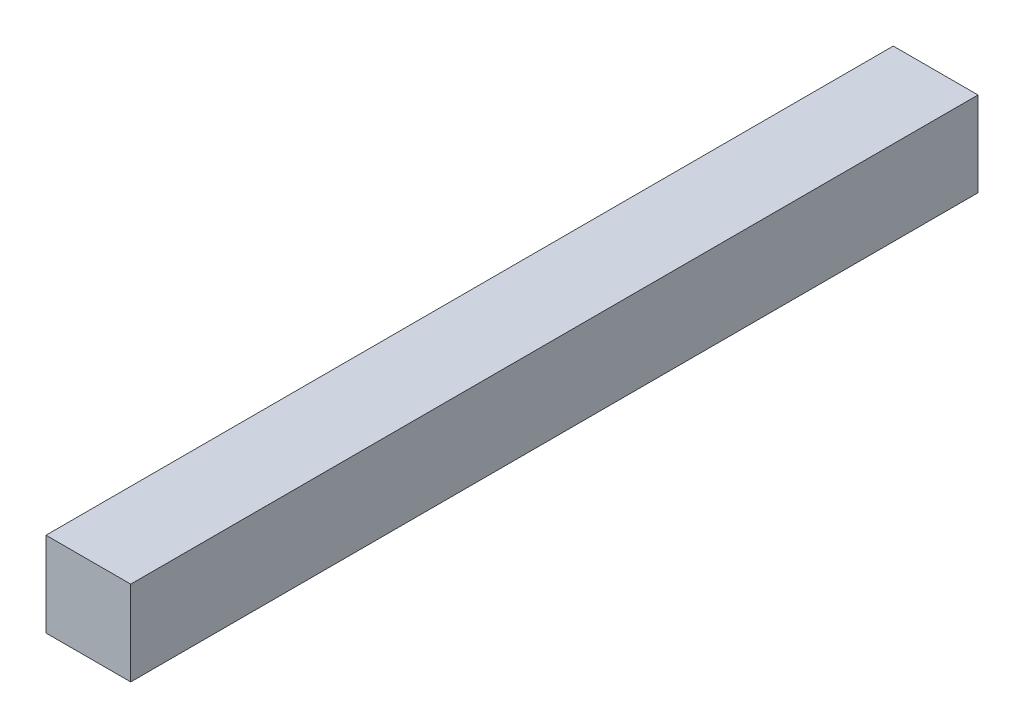
ISO-10303-21;
HEADER;
FILE_DESCRIPTION(('STEP AP214'),'2;1');
FILE_NAME('part.step','',(''),(''),'','','');
FILE_SCHEMA(('AUTOMOTIVE_DESIGN { 1 0 10303 214 1 1 1 1 }'));
ENDSEC;
DATA;
#1=APPLICATION_CONTEXT('core data for automotive mechanical design processes');
#2=APPLICATION_PROTOCOL_DEFINITION('international standard','automotive_design',2000,#1);
#3=PRODUCT_CONTEXT('',#1,'mechanical');
#4=PRODUCT('Part','Part','',(#3));
#5=PRODUCT_RELATED_PRODUCT_CATEGORY('part','',(#4));
#6=PRODUCT_DEFINITION_FORMATION('','',#4);
#7=PRODUCT_DEFINITION_CONTEXT('part definition',#1,'design');
#8=PRODUCT_DEFINITION('design','',#6,#7);
#9=PRODUCT_DEFINITION_SHAPE('','',#8);
#10=(LENGTH_UNIT() NAMED_UNIT(*) SI_UNIT(.MILLI.,.METRE.));
#11=(NAMED_UNIT(*) PLANE_ANGLE_UNIT() SI_UNIT($,.RADIAN.));
#12=(NAMED_UNIT(*) SI_UNIT($,.STERADIAN.) SOLID_ANGLE_UNIT());
#13=UNCERTAINTY_MEASURE_WITH_UNIT(LENGTH_MEASURE(1.E-05),#10,'distance_accuracy_value','');
#14=(GEOMETRIC_REPRESENTATION_CONTEXT(3) GLOBAL_UNCERTAINTY_ASSIGNED_CONTEXT((#13)) GLOBAL_UNIT_ASSIGNED_CONTEXT((#10,
#11,#12)) REPRESENTATION_CONTEXT('',''));
#15=CARTESIAN_POINT('',(0.,0.,0.));
#16=DIRECTION('',(0.,0.,1.));
#17=DIRECTION('',(1.,0.,0.));
#18=AXIS2_PLACEMENT_3D('',#15,#16,#17);
#19=CARTESIAN_POINT('',(0.,0.,200.));
#20=DIRECTION('',(1.,0.,0.));
#21=DIRECTION('',(0.,0.,-1.));
#22=AXIS2_PLACEMENT_3D('',#19,#20,#21);
#23=PLANE('',#22);
#24=DIRECTION('',(0.,-1.,0.));
#25=VECTOR('',#24,1.);
#26=CARTESIAN_POINT('',(0.,0.,0.));
#27=LINE('',#26,#25);
#28=CARTESIAN_POINT('',(0.,20.,0.));
#29=VERTEX_POINT('',#28);
#30=CARTESIAN_POINT('',(0.,0.,0.));
#31=VERTEX_POINT('',#30);
#32=EDGE_CURVE('E97',#29,#31,#27,.T.);
#33=ORIENTED_EDGE('',*,*,#32,.T.);
#34=DIRECTION('',(0.,0.,-1.));
#35=VECTOR('',#34,1.);
#36=CARTESIAN_POINT('',(0.,0.,200.));
#37=LINE('',#36,#35);
#38=CARTESIAN_POINT('',(0.,0.,200.));
#39=VERTEX_POINT('',#38);
#40=EDGE_CURVE('E11',#39,#31,#37,.T.);
#41=ORIENTED_EDGE('',*,*,#40,.F.);
#42=DIRECTION('',(0.,-1.,0.));
#43=VECTOR('',#42,1.);
#44=CARTESIAN_POINT('',(0.,0.,200.));
#45=LINE('',#44,#43);
#46=CARTESIAN_POINT('',(0.,20.,200.));
#47=VERTEX_POINT('',#46);
#48=EDGE_CURVE('E85',#47,#39,#45,.T.);
#49=ORIENTED_EDGE('',*,*,#48,.F.);
#50=DIRECTION('',(0.,0.,-1.));
#51=VECTOR('',#50,1.);
#52=CARTESIAN_POINT('',(0.,20.,200.));
#53=LINE('',#52,#51);
#54=EDGE_CURVE('E93',#47,#29,#53,.T.);
#55=ORIENTED_EDGE('',*,*,#54,.T.);
#56=EDGE_LOOP('',(#33,#41,#49,#55));
#57=FACE_BOUND('',#56,.T.);
#58=ADVANCED_FACE('F34',(#57),#23,.F.);
#59=CARTESIAN_POINT('',(0.,0.,200.));
#60=DIRECTION('',(0.,1.,0.));
#61=DIRECTION('',(0.,0.,1.));
#62=AXIS2_PLACEMENT_3D('',#59,#60,#61);
#63=PLANE('',#62);
#64=DIRECTION('',(1.,0.,0.));
#65=VECTOR('',#64,1.);
#66=CARTESIAN_POINT('',(0.,0.,0.));
#67=LINE('',#66,#65);
#68=CARTESIAN_POINT('',(20.,0.,0.));
#69=VERTEX_POINT('',#68);
#70=EDGE_CURVE('E89',#31,#69,#67,.T.);
#71=ORIENTED_EDGE('',*,*,#70,.T.);
#72=DIRECTION('',(0.,0.,-1.));
#73=VECTOR('',#72,1.);
#74=CARTESIAN_POINT('',(20.,0.,200.));
#75=LINE('',#74,#73);
#76=CARTESIAN_POINT('',(20.,0.,200.));
#77=VERTEX_POINT('',#76);
#78=EDGE_CURVE('E42',#77,#69,#75,.T.);
#79=ORIENTED_EDGE('',*,*,#78,.F.);
#80=DIRECTION('',(1.,0.,0.));
#81=VECTOR('',#80,1.);
#82=CARTESIAN_POINT('',(0.,0.,200.));
#83=LINE('',#82,#81);
#84=EDGE_CURVE('E80',#39,#77,#83,.T.);
#85=ORIENTED_EDGE('',*,*,#84,.F.);
#86=ORIENTED_EDGE('',*,*,#40,.T.);
#87=EDGE_LOOP('',(#71,#79,#85,#86));
#88=FACE_BOUND('',#87,.T.);
#89=ADVANCED_FACE('F88',(#88),#63,.F.);
#90=CARTESIAN_POINT('',(20.,0.,200.));
#91=DIRECTION('',(-1.,0.,0.));
#92=DIRECTION('',(0.,0.,1.));
#93=AXIS2_PLACEMENT_3D('',#90,#91,#92);
#94=PLANE('',#93);
#95=DIRECTION('',(0.,1.,0.));
#96=VECTOR('',#95,1.);
#97=CARTESIAN_POINT('',(20.,0.,0.));
#98=LINE('',#97,#96);
#99=CARTESIAN_POINT('',(20.,20.,0.));
#100=VERTEX_POINT('',#99);
#101=EDGE_CURVE('E67',#69,#100,#98,.T.);
#102=ORIENTED_EDGE('',*,*,#101,.T.);
#103=DIRECTION('',(0.,0.,-1.));
#104=VECTOR('',#103,1.);
#105=CARTESIAN_POINT('',(20.,20.,200.));
#106=LINE('',#105,#104);
#107=CARTESIAN_POINT('',(20.,20.,200.));
#108=VERTEX_POINT('',#107);
#109=EDGE_CURVE('E90',#108,#100,#106,.T.);
#110=ORIENTED_EDGE('',*,*,#109,.F.);
#111=DIRECTION('',(0.,1.,0.));
#112=VECTOR('',#111,1.);
#113=CARTESIAN_POINT('',(20.,0.,200.));
#114=LINE('',#113,#112);
#115=EDGE_CURVE('E83',#77,#108,#114,.T.);
#116=ORIENTED_EDGE('',*,*,#115,.F.);
#117=ORIENTED_EDGE('',*,*,#78,.T.);
#118=EDGE_LOOP('',(#102,#110,#116,#117));
#119=FACE_BOUND('',#118,.T.);
#120=ADVANCED_FACE('F91',(#119),#94,.F.);
#121=CARTESIAN_POINT('',(0.,20.,200.));
#122=DIRECTION('',(0.,-1.,0.));
#123=DIRECTION('',(0.,0.,-1.));
#124=AXIS2_PLACEMENT_3D('',#121,#122,#123);
#125=PLANE('',#124);
#126=DIRECTION('',(-1.,0.,0.));
#127=VECTOR('',#126,1.);
#128=CARTESIAN_POINT('',(0.,20.,0.));
#129=LINE('',#128,#127);
#130=EDGE_CURVE('E73',#100,#29,#129,.T.);
#131=ORIENTED_EDGE('',*,*,#130,.T.);
#132=ORIENTED_EDGE('',*,*,#54,.F.);
#133=DIRECTION('',(-1.,0.,0.));
#134=VECTOR('',#133,1.);
#135=CARTESIAN_POINT('',(0.,20.,200.));
#136=LINE('',#135,#134);
#137=EDGE_CURVE('E50',#108,#47,#136,.T.);
#138=ORIENTED_EDGE('',*,*,#137,.F.);
#139=ORIENTED_EDGE('',*,*,#109,.T.);
#140=EDGE_LOOP('',(#131,#132,#138,#139));
#141=FACE_BOUND('',#140,.T.);
#142=ADVANCED_FACE('F104',(#141),#125,.F.);
#143=CARTESIAN_POINT('',(0.,0.,200.));
#144=DIRECTION('',(0.,0.,-1.));
#145=DIRECTION('',(-1.,0.,0.));
#146=AXIS2_PLACEMENT_3D('',#143,#144,#145);
#147=PLANE('',#146);
#148=ORIENTED_EDGE('',*,*,#48,.T.);
#149=ORIENTED_EDGE('',*,*,#84,.T.);
#150=ORIENTED_EDGE('',*,*,#115,.T.);
#151=ORIENTED_EDGE('',*,*,#137,.T.);
#152=EDGE_LOOP('',(#148,#149,#150,#151));
#153=FACE_BOUND('',#152,.T.);
#154=ADVANCED_FACE('F81',(#153),#147,.F.);
#155=CARTESIAN_POINT('',(0.,0.,0.));
#156=DIRECTION('',(0.,0.,-1.));
#157=DIRECTION('',(-1.,0.,0.));
#158=AXIS2_PLACEMENT_3D('',#155,#156,#157);
#159=PLANE('',#158);
#160=ORIENTED_EDGE('',*,*,#32,.F.);
#161=ORIENTED_EDGE('',*,*,#130,.F.);
#162=ORIENTED_EDGE('',*,*,#101,.F.);
#163=ORIENTED_EDGE('',*,*,#70,.F.);
#164=EDGE_LOOP('',(#160,#161,#162,#163));
#165=FACE_BOUND('',#164,.T.);
#166=ADVANCED_FACE('F107',(#165),#159,.T.);
#167=CLOSED_SHELL('',(#58,#89,#120,#142,#154,#166));
#168=MANIFOLD_SOLID_BREP('B2',#167);
#169=ADVANCED_BREP_SHAPE_REPRESENTATION('',(#18,#168),#14);
#170=SHAPE_DEFINITION_REPRESENTATION(#9,#169);
ENDSEC;
END-ISO-10303-21;
